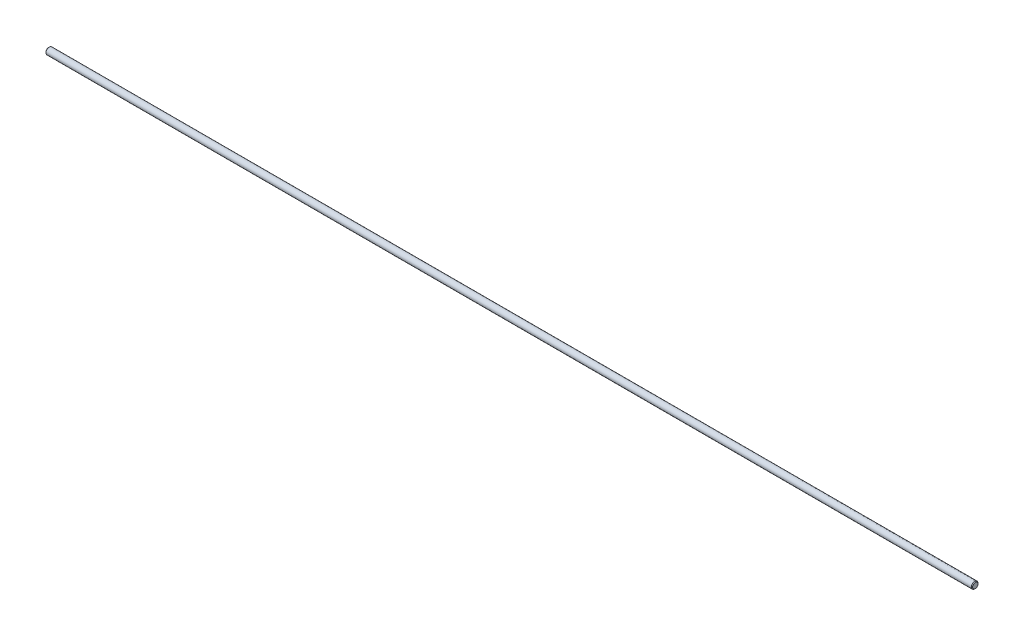
ISO-10303-21;
HEADER;
FILE_DESCRIPTION(('STEP AP214'),'2;1');
FILE_NAME('part.step','',(''),(''),'','','');
FILE_SCHEMA(('AUTOMOTIVE_DESIGN { 1 0 10303 214 1 1 1 1 }'));
ENDSEC;
DATA;
#1=APPLICATION_CONTEXT('core data for automotive mechanical design processes');
#2=APPLICATION_PROTOCOL_DEFINITION('international standard','automotive_design',2000,#1);
#3=PRODUCT_CONTEXT('',#1,'mechanical');
#4=PRODUCT('Part','Part','',(#3));
#5=PRODUCT_RELATED_PRODUCT_CATEGORY('part','',(#4));
#6=PRODUCT_DEFINITION_FORMATION('','',#4);
#7=PRODUCT_DEFINITION_CONTEXT('part definition',#1,'design');
#8=PRODUCT_DEFINITION('design','',#6,#7);
#9=PRODUCT_DEFINITION_SHAPE('','',#8);
#10=(LENGTH_UNIT() NAMED_UNIT(*) SI_UNIT(.MILLI.,.METRE.));
#11=(NAMED_UNIT(*) PLANE_ANGLE_UNIT() SI_UNIT($,.RADIAN.));
#12=(NAMED_UNIT(*) SI_UNIT($,.STERADIAN.) SOLID_ANGLE_UNIT());
#13=UNCERTAINTY_MEASURE_WITH_UNIT(LENGTH_MEASURE(1.E-05),#10,'distance_accuracy_value','');
#14=(GEOMETRIC_REPRESENTATION_CONTEXT(3) GLOBAL_UNCERTAINTY_ASSIGNED_CONTEXT((#13)) GLOBAL_UNIT_ASSIGNED_CONTEXT((#10,
#11,#12)) REPRESENTATION_CONTEXT('',''));
#15=CARTESIAN_POINT('',(0.,0.,0.));
#16=DIRECTION('',(0.,0.,1.));
#17=DIRECTION('',(1.,0.,0.));
#18=AXIS2_PLACEMENT_3D('',#15,#16,#17);
#19=CARTESIAN_POINT('',(-762.,0.,0.));
#20=DIRECTION('',(1.,0.,0.));
#21=DIRECTION('',(0.,0.,-1.));
#22=AXIS2_PLACEMENT_3D('',#19,#20,#21);
#23=CYLINDRICAL_SURFACE('',#22,4.7625);
#24=CARTESIAN_POINT('',(-557.8475,0.,0.));
#25=DIRECTION('',(-1.,0.,0.));
#26=DIRECTION('',(0.,0.,1.));
#27=AXIS2_PLACEMENT_3D('',#24,#25,#26);
#28=CIRCLE('',#27,4.7625);
#29=CARTESIAN_POINT('',(-557.8475,0.,4.7625));
#30=VERTEX_POINT('',#29);
#31=EDGE_CURVE('E37',#30,#30,#28,.F.);
#32=ORIENTED_EDGE('',*,*,#31,.T.);
#33=EDGE_LOOP('',(#32));
#34=FACE_BOUND('',#33,.T.);
#35=CARTESIAN_POINT('',(761.0475,0.,0.));
#36=DIRECTION('',(1.,0.,0.));
#37=DIRECTION('',(0.,0.,-1.));
#38=AXIS2_PLACEMENT_3D('',#35,#36,#37);
#39=CIRCLE('',#38,4.7625);
#40=CARTESIAN_POINT('',(761.0475,0.,4.76250000000006));
#41=VERTEX_POINT('',#40);
#42=EDGE_CURVE('E41',#41,#41,#39,.F.);
#43=ORIENTED_EDGE('',*,*,#42,.T.);
#44=EDGE_LOOP('',(#43));
#45=FACE_BOUND('',#44,.T.);
#46=ADVANCED_FACE('F30',(#34,#45),#23,.T.);
#47=CARTESIAN_POINT('',(762.,0.,0.));
#48=DIRECTION('',(1.,0.,0.));
#49=DIRECTION('',(0.,0.,-1.));
#50=AXIS2_PLACEMENT_3D('',#47,#48,#49);
#51=PLANE('',#50);
#52=CARTESIAN_POINT('',(762.,0.,0.));
#53=DIRECTION('',(1.,0.,0.));
#54=DIRECTION('',(0.,0.,-1.));
#55=AXIS2_PLACEMENT_3D('',#52,#53,#54);
#56=CIRCLE('',#55,3.80999999999987);
#57=CARTESIAN_POINT('',(762.,0.,3.80999999999992));
#58=VERTEX_POINT('',#57);
#59=EDGE_CURVE('E45',#58,#58,#56,.T.);
#60=ORIENTED_EDGE('',*,*,#59,.T.);
#61=EDGE_LOOP('',(#60));
#62=FACE_BOUND('',#61,.T.);
#63=ADVANCED_FACE('F51',(#62),#51,.T.);
#64=CARTESIAN_POINT('',(762.,0.,0.));
#65=DIRECTION('',(-1.,0.,0.));
#66=DIRECTION('',(0.,0.,1.));
#67=AXIS2_PLACEMENT_3D('',#64,#65,#66);
#68=CONICAL_SURFACE('',#67,3.80999999999987,0.785398163397447);
#69=CARTESIAN_POINT('',(761.0475,0.,4.76250000000006));
#70=CARTESIAN_POINT('',(761.057421875,0.,4.75257812500005));
#71=CARTESIAN_POINT('',(761.06734375,0.,4.74265625000005));
#72=CARTESIAN_POINT('',(761.0871875,0.,4.72281250000005));
#73=CARTESIAN_POINT('',(761.097109375,0.,4.71289062500005));
#74=CARTESIAN_POINT('',(761.116953125,0.,4.69304687500005));
#75=CARTESIAN_POINT('',(761.126875,0.,4.68312500000004));
#76=CARTESIAN_POINT('',(761.14671875,0.,4.66328125000004));
#77=CARTESIAN_POINT('',(761.156640625,0.,4.65335937500004));
#78=CARTESIAN_POINT('',(761.176484375,0.,4.63351562500004));
#79=CARTESIAN_POINT('',(761.18640625,0.,4.62359375000004));
#80=CARTESIAN_POINT('',(761.20625,0.,4.60375000000003));
#81=CARTESIAN_POINT('',(761.216171875,0.,4.59382812500003));
#82=CARTESIAN_POINT('',(761.236015625,0.,4.57398437500003));
#83=CARTESIAN_POINT('',(761.2459375,0.,4.56406250000003));
#84=CARTESIAN_POINT('',(761.26578125,0.,4.54421875000002));
#85=CARTESIAN_POINT('',(761.275703125,0.,4.53429687500002));
#86=CARTESIAN_POINT('',(761.295546875,0.,4.51445312500002));
#87=CARTESIAN_POINT('',(761.30546875,0.,4.50453125000002));
#88=CARTESIAN_POINT('',(761.3253125,0.,4.48468750000002));
#89=CARTESIAN_POINT('',(761.335234375,0.,4.47476562500002));
#90=CARTESIAN_POINT('',(761.355078125,0.,4.45492187500001));
#91=CARTESIAN_POINT('',(761.365,0.,4.44500000000001));
#92=CARTESIAN_POINT('',(761.38484375,0.,4.42515625000001));
#93=CARTESIAN_POINT('',(761.394765625,0.,4.41523437500001));
#94=CARTESIAN_POINT('',(761.414609375,0.,4.39539062500001));
#95=CARTESIAN_POINT('',(761.42453125,0.,4.38546875));
#96=CARTESIAN_POINT('',(761.444375,0.,4.365625));
#97=CARTESIAN_POINT('',(761.454296875,0.,4.355703125));
#98=CARTESIAN_POINT('',(761.474140625,0.,4.335859375));
#99=CARTESIAN_POINT('',(761.4840625,0.,4.32593750000001));
#100=CARTESIAN_POINT('',(761.50390625,0.,4.30609375));
#101=CARTESIAN_POINT('',(761.513828125,0.,4.29617187499998));
#102=CARTESIAN_POINT('',(761.533671875,0.,4.27632812499998));
#103=CARTESIAN_POINT('',(761.54359375,0.,4.26640624999998));
#104=CARTESIAN_POINT('',(761.5634375,0.,4.24656249999999));
#105=CARTESIAN_POINT('',(761.573359375,0.,4.23664062499998));
#106=CARTESIAN_POINT('',(761.593203125,0.,4.21679687499998));
#107=CARTESIAN_POINT('',(761.603125,0.,4.20687499999998));
#108=CARTESIAN_POINT('',(761.62296875,0.,4.18703124999998));
#109=CARTESIAN_POINT('',(761.632890625,0.,4.17710937499997));
#110=CARTESIAN_POINT('',(761.652734375,0.,4.15726562499997));
#111=CARTESIAN_POINT('',(761.66265625,0.,4.14734374999997));
#112=CARTESIAN_POINT('',(761.6825,0.,4.12749999999997));
#113=CARTESIAN_POINT('',(761.692421875,0.,4.11757812499997));
#114=CARTESIAN_POINT('',(761.712265625,0.,4.09773437499996));
#115=CARTESIAN_POINT('',(761.7221875,0.,4.08781249999996));
#116=CARTESIAN_POINT('',(761.74203125,0.,4.06796874999996));
#117=CARTESIAN_POINT('',(761.751953125,0.,4.05804687499996));
#118=CARTESIAN_POINT('',(761.771796875,0.,4.03820312499996));
#119=CARTESIAN_POINT('',(761.78171875,0.,4.02828124999995));
#120=CARTESIAN_POINT('',(761.8015625,0.,4.00843749999995));
#121=CARTESIAN_POINT('',(761.811484375,0.,3.99851562499995));
#122=CARTESIAN_POINT('',(761.831328125,0.,3.97867187499995));
#123=CARTESIAN_POINT('',(761.84125,0.,3.96874999999995));
#124=CARTESIAN_POINT('',(761.86109375,0.,3.94890624999994));
#125=CARTESIAN_POINT('',(761.871015625,0.,3.93898437499994));
#126=CARTESIAN_POINT('',(761.890859375,0.,3.91914062499994));
#127=CARTESIAN_POINT('',(761.90078125,0.,3.90921874999994));
#128=CARTESIAN_POINT('',(761.920625,0.,3.88937499999994));
#129=CARTESIAN_POINT('',(761.930546875,0.,3.87945312499993));
#130=CARTESIAN_POINT('',(761.950390625,0.,3.85960937499993));
#131=CARTESIAN_POINT('',(761.9603125,0.,3.84968749999993));
#132=CARTESIAN_POINT('',(761.98015625,0.,3.82984374999993));
#133=CARTESIAN_POINT('',(761.990078125,0.,3.81992187499993));
#134=CARTESIAN_POINT('',(762.,0.,3.80999999999992));
#135=B_SPLINE_CURVE_WITH_KNOTS('',3,(#69,#70,#71,#72,#73,#74,#75,#76,#77,#78,#79,#80,#81,#82,
#83,#84,#85,#86,#87,#88,#89,#90,#91,#92,#93,#94,#95,#96,#97,#98,#99,#100,#101,#102,#103,#104,
#105,#106,#107,#108,#109,#110,#111,#112,#113,#114,#115,#116,#117,#118,#119,#120,#121,#122,#123,
#124,#125,#126,#127,#128,#129,#130,#131,#132,#133,#134),.UNSPECIFIED.,.F.,.F.,(4,2,2,2,2,2,2,2,
2,2,2,2,2,2,2,2,2,2,2,2,2,2,2,2,2,2,2,2,2,2,2,2,4),(0.,0.0420949505675225,0.0841899011350449,
0.126284851702567,0.168379802270089,0.210474752837612,0.252569703405134,0.294664653972657,
0.336759604540179,0.378854555107702,0.420949505675224,0.463044456242746,0.505139406810269,
0.547234357377791,0.589329307945314,0.631424258512836,0.67351920908028,0.715614159647803,
0.757709110215325,0.799804060782847,0.841899011350369,0.883993961917892,0.926088912485414,
0.968183863052937,1.01027881362046,1.05237376418798,1.0944687147555,1.13656366532303,
1.17865861589055,1.22075356645807,1.26284851702559,1.30494346759312,1.34703841816064),.UNSPECIFIED.);
#136=EDGE_CURVE('BSEAM53',#41,#58,#135,.T.);
#137=ORIENTED_EDGE('',*,*,#42,.F.);
#138=ORIENTED_EDGE('',*,*,#59,.F.);
#139=ORIENTED_EDGE('',*,*,#136,.T.);
#140=ORIENTED_EDGE('',*,*,#136,.F.);
#141=EDGE_LOOP('',(#137,#139,#138,#140));
#142=FACE_BOUND('',#141,.T.);
#143=ADVANCED_FACE('F53',(#142),#68,.T.);
#144=CARTESIAN_POINT('',(-558.8,0.,0.));
#145=DIRECTION('',(-1.,0.,0.));
#146=DIRECTION('',(0.,0.,1.));
#147=AXIS2_PLACEMENT_3D('',#144,#145,#146);
#148=PLANE('',#147);
#149=CARTESIAN_POINT('',(-558.8,0.,0.));
#150=DIRECTION('',(-1.,0.,0.));
#151=DIRECTION('',(0.,0.,1.));
#152=AXIS2_PLACEMENT_3D('',#149,#150,#151);
#153=CIRCLE('',#152,3.81000000000009);
#154=CARTESIAN_POINT('',(-558.8,0.,3.81000000000009));
#155=VERTEX_POINT('',#154);
#156=EDGE_CURVE('E10',#155,#155,#153,.T.);
#157=ORIENTED_EDGE('',*,*,#156,.T.);
#158=EDGE_LOOP('',(#157));
#159=FACE_BOUND('',#158,.T.);
#160=ADVANCED_FACE('F55',(#159),#148,.T.);
#161=CARTESIAN_POINT('',(-557.8475,0.,0.));
#162=DIRECTION('',(1.,0.,0.));
#163=DIRECTION('',(0.,0.,-1.));
#164=AXIS2_PLACEMENT_3D('',#161,#162,#163);
#165=CONICAL_SURFACE('',#164,4.7625,0.785398163397447);
#166=ORIENTED_EDGE('',*,*,#156,.F.);
#167=EDGE_LOOP('',(#166));
#168=FACE_BOUND('',#167,.T.);
#169=ORIENTED_EDGE('',*,*,#31,.F.);
#170=EDGE_LOOP('',(#169));
#171=FACE_BOUND('',#170,.T.);
#172=ADVANCED_FACE('F32',(#168,#171),#165,.T.);
#173=CLOSED_SHELL('',(#46,#63,#143,#160,#172));
#174=MANIFOLD_SOLID_BREP('B2',#173);
#175=ADVANCED_BREP_SHAPE_REPRESENTATION('',(#18,#174),#14);
#176=SHAPE_DEFINITION_REPRESENTATION(#9,#175);
ENDSEC;
END-ISO-10303-21;
